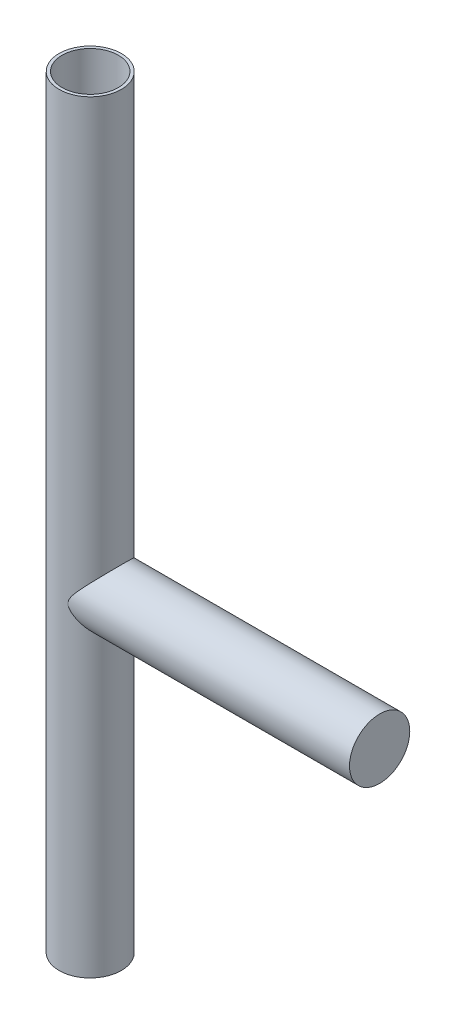
ISO-10303-21;
HEADER;
FILE_DESCRIPTION(('STEP AP214'),'2;1');
FILE_NAME('part.step','',(''),(''),'','','');
FILE_SCHEMA(('AUTOMOTIVE_DESIGN { 1 0 10303 214 1 1 1 1 }'));
ENDSEC;
DATA;
#1=APPLICATION_CONTEXT('core data for automotive mechanical design processes');
#2=APPLICATION_PROTOCOL_DEFINITION('international standard','automotive_design',2000,#1);
#3=PRODUCT_CONTEXT('',#1,'mechanical');
#4=PRODUCT('Part','Part','',(#3));
#5=PRODUCT_RELATED_PRODUCT_CATEGORY('part','',(#4));
#6=PRODUCT_DEFINITION_FORMATION('','',#4);
#7=PRODUCT_DEFINITION_CONTEXT('part definition',#1,'design');
#8=PRODUCT_DEFINITION('design','',#6,#7);
#9=PRODUCT_DEFINITION_SHAPE('','',#8);
#10=(LENGTH_UNIT() NAMED_UNIT(*) SI_UNIT(.MILLI.,.METRE.));
#11=(NAMED_UNIT(*) PLANE_ANGLE_UNIT() SI_UNIT($,.RADIAN.));
#12=(NAMED_UNIT(*) SI_UNIT($,.STERADIAN.) SOLID_ANGLE_UNIT());
#13=UNCERTAINTY_MEASURE_WITH_UNIT(LENGTH_MEASURE(1.E-05),#10,'distance_accuracy_value','');
#14=(GEOMETRIC_REPRESENTATION_CONTEXT(3) GLOBAL_UNCERTAINTY_ASSIGNED_CONTEXT((#13)) GLOBAL_UNIT_ASSIGNED_CONTEXT((#10,
#11,#12)) REPRESENTATION_CONTEXT('',''));
#15=CARTESIAN_POINT('',(0.,0.,0.));
#16=DIRECTION('',(0.,0.,1.));
#17=DIRECTION('',(1.,0.,0.));
#18=AXIS2_PLACEMENT_3D('',#15,#16,#17);
#19=CARTESIAN_POINT('',(0.,-5.,0.));
#20=DIRECTION('',(0.,1.,0.));
#21=DIRECTION('',(0.,0.,1.));
#22=AXIS2_PLACEMENT_3D('',#19,#20,#21);
#23=CYLINDRICAL_SURFACE('',#22,7.75);
#24=CARTESIAN_POINT('',(0.,-5.,0.));
#25=DIRECTION('',(0.,1.,0.));
#26=DIRECTION('',(0.,0.,1.));
#27=AXIS2_PLACEMENT_3D('',#24,#25,#26);
#28=CIRCLE('',#27,7.75);
#29=CARTESIAN_POINT('',(0.,-5.,7.75));
#30=VERTEX_POINT('',#29);
#31=EDGE_CURVE('E70',#30,#30,#28,.T.);
#32=ORIENTED_EDGE('',*,*,#31,.T.);
#33=EDGE_LOOP('',(#32));
#34=FACE_BOUND('',#33,.T.);
#35=CARTESIAN_POINT('',(1.95256241897666,75.,7.5));
#36=CARTESIAN_POINT('',(1.95254027287941,75.1301890502717,7.50000356990272));
#37=CARTESIAN_POINT('',(1.96590520223219,75.2603568940081,7.49656241617327));
#38=CARTESIAN_POINT('',(2.01569819316504,75.5162819695374,7.48331854549107));
#39=CARTESIAN_POINT('',(2.05225463976761,75.6420105092941,7.47348040811489));
#40=CARTESIAN_POINT('',(2.13363712639972,75.865327485485,7.45060684486488));
#41=CARTESIAN_POINT('',(2.17590108832877,75.9639934948249,7.43843077396391));
#42=CARTESIAN_POINT('',(2.2681474237054,76.1572248140775,7.4108262060249));
#43=CARTESIAN_POINT('',(2.31813693956844,76.2517862245286,7.39539469440364));
#44=CARTESIAN_POINT('',(2.47617651022723,76.5305882452537,7.34460192400622));
#45=CARTESIAN_POINT('',(2.59210402189804,76.709487952865,7.30479296654339));
#46=CARTESIAN_POINT('',(2.85729149296307,77.0913591856681,7.20571259971662));
#47=CARTESIAN_POINT('',(3.00864163713575,77.2922162919602,7.14415925232692));
#48=CARTESIAN_POINT('',(3.3171934453091,77.6843476964629,7.00624041361422));
#49=CARTESIAN_POINT('',(3.47440032136982,77.8756130856665,6.92986146123077));
#50=CARTESIAN_POINT('',(3.79048844505221,78.2504467138194,6.76215779582004));
#51=CARTESIAN_POINT('',(3.94937144041231,78.4340056608059,6.67081565643868));
#52=CARTESIAN_POINT('',(4.26590173295146,78.7937680865314,6.47297704973329));
#53=CARTESIAN_POINT('',(4.42354936760267,78.969973635296,6.36648488496098));
#54=CARTESIAN_POINT('',(4.77008079089776,79.3530728523875,6.11265712391416));
#55=CARTESIAN_POINT('',(4.95818344072453,79.5581613734927,5.96149384180011));
#56=CARTESIAN_POINT('',(5.32639528655411,79.9561730500059,5.63494701276092));
#57=CARTESIAN_POINT('',(5.5065008896944,80.1490907534428,5.45955272210076));
#58=CARTESIAN_POINT('',(5.8547129489229,80.5198913908207,5.08429956510327));
#59=CARTESIAN_POINT('',(6.02285659504625,80.6978212711934,4.88452228632779));
#60=CARTESIAN_POINT('',(6.34382195995667,81.0360927605903,4.45974127182885));
#61=CARTESIAN_POINT('',(6.49665810123219,81.1964509390558,4.23476171295629));
#62=CARTESIAN_POINT('',(6.80364239113859,81.5176370856967,3.72473278881411));
#63=CARTESIAN_POINT('',(6.95478060459687,81.6751757748202,3.43570192792498));
#64=CARTESIAN_POINT('',(7.15644612432528,81.8849534856609,2.97918511429341));
#65=CARTESIAN_POINT('',(7.21950433346244,81.9504680102473,2.82315125802899));
#66=CARTESIAN_POINT('',(7.33630454717285,82.071713423744,2.50398942637429));
#67=CARTESIAN_POINT('',(7.3900510089274,82.1274489936331,2.34086489205796));
#68=CARTESIAN_POINT('',(7.48772711238075,82.2286745024491,2.00674606041653));
#69=CARTESIAN_POINT('',(7.53155773015203,82.2740611249008,1.83569132156844));
#70=CARTESIAN_POINT('',(7.6078174013041,82.3529918718908,1.48836051755561));
#71=CARTESIAN_POINT('',(7.64024647712757,82.3865360197397,1.3120844626692));
#72=CARTESIAN_POINT('',(7.69292481367634,82.4410107036105,0.955923074061227));
#73=CARTESIAN_POINT('',(7.7131830076892,82.4619504911098,0.77604048795549));
#74=CARTESIAN_POINT('',(7.74104528569166,82.490747330483,0.414265296344475));
#75=CARTESIAN_POINT('',(7.74865113994895,82.4986062125879,0.232372975619271));
#76=CARTESIAN_POINT('',(7.75086572435814,82.500894551507,-0.107713351385544));
#77=CARTESIAN_POINT('',(7.7470465594858,82.4969484027336,-0.265890370151748));
#78=CARTESIAN_POINT('',(7.72979138508297,82.4791162593342,-0.581155813814566));
#79=CARTESIAN_POINT('',(7.71635553573556,82.4652304302714,-0.738244256799352));
#80=CARTESIAN_POINT('',(7.6801250963743,82.4277751714667,-1.05015842492861));
#81=CARTESIAN_POINT('',(7.65733066802929,82.4042059090055,-1.20498418911287));
#82=CARTESIAN_POINT('',(7.60280151254774,82.347798502893,-1.51133056285157));
#83=CARTESIAN_POINT('',(7.57106646918115,82.3149600313892,-1.66285105529409));
#84=CARTESIAN_POINT('',(7.4999180044693,82.2412954292593,-1.95867303867399));
#85=CARTESIAN_POINT('',(7.46067229268881,82.2006436923805,-2.10305848479811));
#86=CARTESIAN_POINT('',(7.37470118482368,82.1115296651748,-2.38711899506823));
#87=CARTESIAN_POINT('',(7.32797365392898,82.0630651455759,-2.52679270098651));
#88=CARTESIAN_POINT('',(7.17748500075082,81.9068501535315,-2.9378934273682));
#89=CARTESIAN_POINT('',(7.06337770699466,81.7882367916999,-3.20156266232297));
#90=CARTESIAN_POINT('',(6.84637738953641,81.5620960088776,-3.6376074580444));
#91=CARTESIAN_POINT('',(6.74863418835963,81.4600743884691,-3.81555231105567));
#92=CARTESIAN_POINT('',(6.5429539975206,81.2448977289165,-4.15838545438968));
#93=CARTESIAN_POINT('',(6.43501588370935,81.1317414619453,-4.32327230116854));
#94=CARTESIAN_POINT('',(6.21036735788039,80.8955490620631,-4.64022495347486));
#95=CARTESIAN_POINT('',(6.09363518929716,80.7724883705079,-4.79225684512036));
#96=CARTESIAN_POINT('',(5.85316182217974,80.5180368091598,-5.08316928074444));
#97=CARTESIAN_POINT('',(5.72942075057901,80.386646090221,-5.22205006277217));
#98=CARTESIAN_POINT('',(5.43005788870909,80.0672657820773,-5.53529654472826));
#99=CARTESIAN_POINT('',(5.25198337696498,79.8761204328712,-5.70411469850548));
#100=CARTESIAN_POINT('',(4.88838841507936,79.4821454384826,-6.01863497610819));
#101=CARTESIAN_POINT('',(4.70286412060642,79.2793097365728,-6.164324967878));
#102=CARTESIAN_POINT('',(4.32780783607666,78.8633578794395,-6.43317336208854));
#103=CARTESIAN_POINT('',(4.13828151045811,78.6502557705075,-6.55636150349144));
#104=CARTESIAN_POINT('',(3.75872251288581,78.2136113870479,-6.78107931429117));
#105=CARTESIAN_POINT('',(3.56869020835096,77.9900753859155,-6.88262179881014));
#106=CARTESIAN_POINT('',(3.23422142691717,77.5804176578913,-7.04477821649563));
#107=CARTESIAN_POINT('',(3.08883901014458,77.3967029966683,-7.1094921177642));
#108=CARTESIAN_POINT('',(2.87670542265433,77.1134788910826,-7.19673195269228));
#109=CARTESIAN_POINT('',(2.80694578179858,77.0177381712533,-7.22418636545723));
#110=CARTESIAN_POINT('',(2.67053132359378,76.8231934127341,-7.27571861977974));
#111=CARTESIAN_POINT('',(2.60387604686119,76.7243898309137,-7.29979696199499));
#112=CARTESIAN_POINT('',(2.44170603015909,76.4708645470277,-7.35603077462036));
#113=CARTESIAN_POINT('',(2.34914032570697,76.3137036848471,-7.38590393395599));
#114=CARTESIAN_POINT('',(2.18375261076396,75.987843446622,-7.43647380921712));
#115=CARTESIAN_POINT('',(2.11085988094345,75.8191882054588,-7.45720356858238));
#116=CARTESIAN_POINT('',(2.02171618008148,75.5343924563744,-7.4817448089777));
#117=CARTESIAN_POINT('',(1.99447925788354,75.4221309836867,-7.48898274066381));
#118=CARTESIAN_POINT('',(1.95903966691131,75.1945637818613,-7.49833482995199));
#119=CARTESIAN_POINT('',(1.95078343428337,75.0792675505072,-7.50046340699817));
#120=CARTESIAN_POINT('',(1.95500219863361,74.8488888492252,-7.49936454467398));
#121=CARTESIAN_POINT('',(1.96751716142526,74.7338072189072,-7.49612677995322));
#122=CARTESIAN_POINT('',(2.01067644785891,74.5072296445273,-7.48466009422864));
#123=CARTESIAN_POINT('',(2.04137116110638,74.3957445783591,-7.47641729895754));
#124=CARTESIAN_POINT('',(2.11124425163456,74.192030006266,-7.45696184233885));
#125=CARTESIAN_POINT('',(2.14881562505552,74.0991728124093,-7.44627002769129));
#126=CARTESIAN_POINT('',(2.23126745170366,73.9171115507853,-7.42198045069847));
#127=CARTESIAN_POINT('',(2.27615471921823,73.8279109868178,-7.40837997539909));
#128=CARTESIAN_POINT('',(2.37129101172992,73.6524160318184,-7.37848068654962));
#129=CARTESIAN_POINT('',(2.42156263489764,73.5661360623893,-7.36217032827195));
#130=CARTESIAN_POINT('',(2.5257751687595,73.3964058989416,-7.32707228926546));
#131=CARTESIAN_POINT('',(2.57971490246393,73.3129548099765,-7.30828540138392));
#132=CARTESIAN_POINT('',(2.71840224747815,73.1063971949827,-7.25814312053561));
#133=CARTESIAN_POINT('',(2.80482384387862,72.9847876231463,-7.22526652273103));
#134=CARTESIAN_POINT('',(2.98123783204384,72.7457264959351,-7.15428459342945));
#135=CARTESIAN_POINT('',(3.07123161782724,72.6282765983539,-7.1161772061114));
#136=CARTESIAN_POINT('',(3.25340740517797,72.3966798065256,-7.03475708264581));
#137=CARTESIAN_POINT('',(3.34559201782877,72.2825372546658,-6.99143785657831));
#138=CARTESIAN_POINT('',(3.53104345280444,72.0572405424322,-6.89963426250104));
#139=CARTESIAN_POINT('',(3.62431040768229,71.9460867537373,-6.85114925576766));
#140=CARTESIAN_POINT('',(3.90469664444104,71.6165678565567,-6.69784878168772));
#141=CARTESIAN_POINT('',(4.0923402536245,71.4022210232242,-6.58521463103373));
#142=CARTESIAN_POINT('',(4.46468347287635,70.9838013499097,-6.33869131205799));
#143=CARTESIAN_POINT('',(4.64938534354837,70.7797203320953,-6.20481942670768));
#144=CARTESIAN_POINT('',(4.98367927569591,70.4142527778987,-5.93830512381304));
#145=CARTESIAN_POINT('',(5.13413680618987,70.2512819918157,-5.80893408684942));
#146=CARTESIAN_POINT('',(5.42917193428811,69.9337553727086,-5.53419195861925));
#147=CARTESIAN_POINT('',(5.57374849376934,69.7792010237571,-5.38881805913076));
#148=CARTESIAN_POINT('',(5.99534743655019,69.3305888588968,-4.92858519858198));
#149=CARTESIAN_POINT('',(6.2612522124272,69.0504853290095,-4.58883251688156));
#150=CARTESIAN_POINT('',(6.68056512454135,68.6109114307562,-3.94191283325759));
#151=CARTESIAN_POINT('',(6.8450451348759,68.4392087911171,-3.65030961219098));
#152=CARTESIAN_POINT('',(7.06626080229294,68.2088291137177,-3.18743418734476));
#153=CARTESIAN_POINT('',(7.13574572732094,68.1365679404697,-3.02890605250445));
#154=CARTESIAN_POINT('',(7.26514755941465,68.0021288215223,-2.7038308639568));
#155=CARTESIAN_POINT('',(7.32506582139295,67.9399494479329,-2.53728495015218));
#156=CARTESIAN_POINT('',(7.42607041884569,67.8352122238539,-2.22240882282034));
#157=CARTESIAN_POINT('',(7.46863250494605,67.7911111671621,-2.0750632112109));
#158=CARTESIAN_POINT('',(7.54536227034881,67.7116463670265,-1.77590561385838));
#159=CARTESIAN_POINT('',(7.57953144814348,67.6762810638716,-1.62409443083812));
#160=CARTESIAN_POINT('',(7.63889095729658,67.6148651229367,-1.31692911782155));
#161=CARTESIAN_POINT('',(7.66408486499287,67.5888107750468,-1.16157642530945));
#162=CARTESIAN_POINT('',(7.70505181339951,67.5464536995863,-0.848308586543059));
#163=CARTESIAN_POINT('',(7.72082474811813,67.5301510817287,-0.6903934114798));
#164=CARTESIAN_POINT('',(7.74267536431238,67.5075684862173,-0.372698536172449));
#165=CARTESIAN_POINT('',(7.74872388511626,67.5013186538993,-0.212914669877019));
#166=CARTESIAN_POINT('',(7.75091283288039,67.4990567378023,0.106793936134085));
#167=CARTESIAN_POINT('',(7.7470532490232,67.5030446652005,0.266718676003372));
#168=CARTESIAN_POINT('',(7.72950286697246,67.5211819253413,0.585461348422942));
#169=CARTESIAN_POINT('',(7.71581102520552,67.5353323367069,0.744279161679741));
#170=CARTESIAN_POINT('',(7.67886574858892,67.5735269088175,1.05958530949372));
#171=CARTESIAN_POINT('',(7.65561238406324,67.5975709967957,1.21607366117507));
#172=CARTESIAN_POINT('',(7.60120639027559,67.6538521494461,1.51879920424658));
#173=CARTESIAN_POINT('',(7.57044825176574,67.6856801996299,1.66518380575865));
#174=CARTESIAN_POINT('',(7.50108421931344,67.7574969661752,1.95405768952563));
#175=CARTESIAN_POINT('',(7.46247536655688,67.7974887593488,2.09654548009397));
#176=CARTESIAN_POINT('',(7.33568823909152,67.9289067374357,2.517084366705));
#177=CARTESIAN_POINT('',(7.2365140742332,68.031811992587,2.78840196165883));
#178=CARTESIAN_POINT('',(7.04767030891197,68.2281728172955,3.2298441746521));
#179=CARTESIAN_POINT('',(6.96422111951203,68.3150490189622,3.40572684810952));
#180=CARTESIAN_POINT('',(6.7871010108309,68.4997752018249,3.74627564451735));
#181=CARTESIAN_POINT('',(6.69342684066661,68.5976286733591,3.91093817300184));
#182=CARTESIAN_POINT('',(6.39895314391098,68.9059159182756,4.38813382240221));
#183=CARTESIAN_POINT('',(6.18492207997442,69.1308489170234,4.68337854030551));
#184=CARTESIAN_POINT('',(5.80429472867883,69.5337220845628,5.14113393117714));
#185=CARTESIAN_POINT('',(5.64409298887496,69.7040384546007,5.31609945829633));
#186=CARTESIAN_POINT('',(5.31495938398476,70.0562921696452,5.64515827224314));
#187=CARTESIAN_POINT('',(5.14602359860733,70.2382347418915,5.79924207191395));
#188=CARTESIAN_POINT('',(4.80226359823655,70.611988315471,6.0869508369384));
#189=CARTESIAN_POINT('',(4.62744405222879,70.8037915529146,6.22059157844494));
#190=CARTESIAN_POINT('',(4.27447335653798,71.1965751083213,6.46821713069223));
#191=CARTESIAN_POINT('',(4.09632352718351,71.3975518330758,6.58220955541836));
#192=CARTESIAN_POINT('',(3.73491438100616,71.8143477918852,6.79395342805739));
#193=CARTESIAN_POINT('',(3.55164483015955,72.0304192761152,6.89119412185364));
#194=CARTESIAN_POINT('',(3.2802809454079,72.3633760397362,7.02227970135439));
#195=CARTESIAN_POINT('',(3.19036253278028,72.4759080204377,7.06353299924593));
#196=CARTESIAN_POINT('',(3.0127964347602,72.7044258960287,7.14107255141409));
#197=CARTESIAN_POINT('',(2.92514844291636,72.8204113201971,7.17735947889158));
#198=CARTESIAN_POINT('',(2.77048898723196,73.0334402954281,7.23825835964615));
#199=CARTESIAN_POINT('',(2.70280222510427,73.1297361663225,7.26376416720267));
#200=CARTESIAN_POINT('',(2.5711370244475,73.3256291305036,7.31140529448361));
#201=CARTESIAN_POINT('',(2.50715764099913,73.4252253723442,7.33354147540362));
#202=CARTESIAN_POINT('',(2.3847968889834,73.6283837653794,7.3742381293891));
#203=CARTESIAN_POINT('',(2.32640834468138,73.7319405875643,7.39280321763623));
#204=CARTESIAN_POINT('',(2.21801632314516,73.943883092654,7.42604304105235));
#205=CARTESIAN_POINT('',(2.16800416460252,74.0522636268904,7.44072181329136));
#206=CARTESIAN_POINT('',(2.07177383643325,74.296639772884,7.46814667247941));
#207=CARTESIAN_POINT('',(2.02824367384823,74.4338696270216,7.47994246052326));
#208=CARTESIAN_POINT('',(1.96874742834689,74.7141070116345,7.49583999418336));
#209=CARTESIAN_POINT('',(1.9525867330331,74.8570662866797,7.49999608062697));
#210=CARTESIAN_POINT('',(1.95256241897666,75.,7.5));
#211=B_SPLINE_CURVE_WITH_KNOTS('',3,(#35,#36,#37,#38,#39,#40,#41,#42,#43,#44,#45,#46,#47,#48,
#49,#50,#51,#52,#53,#54,#55,#56,#57,#58,#59,#60,#61,#62,#63,#64,#65,#66,#67,#68,#69,#70,#71,#72,
#73,#74,#75,#76,#77,#78,#79,#80,#81,#82,#83,#84,#85,#86,#87,#88,#89,#90,#91,#92,#93,#94,#95,#96,
#97,#98,#99,#100,#101,#102,#103,#104,#105,#106,#107,#108,#109,#110,#111,#112,#113,#114,#115,
#116,#117,#118,#119,#120,#121,#122,#123,#124,#125,#126,#127,#128,#129,#130,#131,#132,#133,#134,
#135,#136,#137,#138,#139,#140,#141,#142,#143,#144,#145,#146,#147,#148,#149,#150,#151,#152,#153,
#154,#155,#156,#157,#158,#159,#160,#161,#162,#163,#164,#165,#166,#167,#168,#169,#170,#171,#172,
#173,#174,#175,#176,#177,#178,#179,#180,#181,#182,#183,#184,#185,#186,#187,#188,#189,#190,#191,
#192,#193,#194,#195,#196,#197,#198,#199,#200,#201,#202,#203,#204,#205,#206,#207,#208,#209,#210),
.UNSPECIFIED.,.T.,.F.,(4,2,2,2,2,2,2,2,2,2,2,2,2,2,2,2,2,2,2,2,2,2,2,2,2,2,2,2,2,2,2,2,2,2,2,2,
2,2,2,2,2,2,2,2,2,2,2,2,2,2,2,2,2,2,2,2,2,2,2,2,2,2,2,2,2,2,2,2,2,2,2,2,2,2,2,2,2,2,2,2,2,2,2,2,
2,2,2,4),(0.,0.389965564005651,0.782108988864908,1.1057137636422,1.42961952673076,
2.07891859918032,2.8549128169626,3.63161493055298,4.4092281193448,5.18662090806519,
6.13550681260253,7.08481480004491,8.03102919172628,8.97634351877103,10.0584379073188,
10.5996994453947,11.1407011819244,11.6868880161218,12.2330737752045,12.7788581488699,
13.3245661520178,13.7987861199812,14.2729981891474,14.7472020666762,15.2214227189288,
15.6860822606644,16.1508746221569,17.0799467438483,17.7607803274752,18.4416890715191,
19.124341510672,19.8069815907228,20.7387557636887,21.6710171023497,22.6020372847638,
23.5325047244496,24.2610626590175,24.6257618322243,24.9904068646771,25.5440561389555,
26.095687843728,26.441544400224,26.786423738741,27.131967428461,27.4784733885602,
27.7802416308171,28.0822925743102,28.3856649695257,28.6889404765525,29.1469904800454,
29.6052210259879,30.0640281962207,30.5228921617043,31.4409221238513,32.3582088025692,
33.1278291547124,33.8975847776859,35.4320894342603,36.556432885814,37.1185470293559,
37.6805814907327,38.1588503617203,38.6370337791346,39.1150264431436,39.5930244847623,
40.0724532469814,40.5518825326298,41.0313627113298,41.5108393635676,41.9691272636757,
42.427588206689,43.3439233557735,43.982695665884,44.621671659125,45.9013675912406,
46.7765099119065,47.6520485108973,48.526908000108,49.4014277036395,50.2991346216391,
50.7485376087935,51.1978796180658,51.5590728734699,51.9201736610047,52.280804589343,
52.6410594144758,53.0722793711016,53.5004200328087),.UNSPECIFIED.);
#212=CARTESIAN_POINT('',(1.95256241897666,75.,7.5));
#213=VERTEX_POINT('',#212);
#214=EDGE_CURVE('E76',#213,#213,#211,.T.);
#215=ORIENTED_EDGE('',*,*,#214,.T.);
#216=EDGE_LOOP('',(#215));
#217=FACE_BOUND('',#216,.T.);
#218=CARTESIAN_POINT('',(0.,185.,0.));
#219=DIRECTION('',(0.,1.,0.));
#220=DIRECTION('',(0.,0.,1.));
#221=AXIS2_PLACEMENT_3D('',#218,#219,#220);
#222=CIRCLE('',#221,7.75);
#223=CARTESIAN_POINT('',(0.,185.,7.75));
#224=VERTEX_POINT('',#223);
#225=EDGE_CURVE('E78',#224,#224,#222,.T.);
#226=ORIENTED_EDGE('',*,*,#225,.F.);
#227=EDGE_LOOP('',(#226));
#228=FACE_BOUND('',#227,.T.);
#229=ADVANCED_FACE('F35',(#34,#217,#228),#23,.T.);
#230=CARTESIAN_POINT('',(0.,-5.,0.));
#231=DIRECTION('',(0.,1.,0.));
#232=DIRECTION('',(0.,0.,1.));
#233=AXIS2_PLACEMENT_3D('',#230,#231,#232);
#234=CYLINDRICAL_SURFACE('',#233,7.);
#235=CARTESIAN_POINT('',(0.,-5.,0.));
#236=DIRECTION('',(0.,1.,0.));
#237=DIRECTION('',(0.,0.,1.));
#238=AXIS2_PLACEMENT_3D('',#235,#236,#237);
#239=CIRCLE('',#238,7.);
#240=CARTESIAN_POINT('',(0.,-5.,7.));
#241=VERTEX_POINT('',#240);
#242=EDGE_CURVE('E86',#241,#241,#239,.T.);
#243=ORIENTED_EDGE('',*,*,#242,.F.);
#244=EDGE_LOOP('',(#243));
#245=FACE_BOUND('',#244,.T.);
#246=DIRECTION('',(0.,1.,0.));
#247=VECTOR('',#246,1.);
#248=CARTESIAN_POINT('',(0.,-5.,-7.));
#249=LINE('',#248,#247);
#250=CARTESIAN_POINT('',(0.,77.6925824035672,-7.));
#251=VERTEX_POINT('',#250);
#252=CARTESIAN_POINT('',(0.,72.3074175964327,-7.));
#253=VERTEX_POINT('',#252);
#254=EDGE_CURVE('E11',#251,#253,#249,.F.);
#255=ORIENTED_EDGE('',*,*,#254,.F.);
#256=CARTESIAN_POINT('',(0.,77.6925824035672,7.));
#257=CARTESIAN_POINT('',(0.0946610655207335,77.6924617618599,7.00002488804256));
#258=CARTESIAN_POINT('',(0.189229245799089,77.6975722107889,6.99808107045153));
#259=CARTESIAN_POINT('',(0.376896117070595,77.7172681915499,6.99046792032722));
#260=CARTESIAN_POINT('',(0.469998842608382,77.7318199072187,6.98481188316449));
#261=CARTESIAN_POINT('',(0.652226065310895,77.7690334735146,6.970137541565));
#262=CARTESIAN_POINT('',(0.741393027120209,77.7915205440642,6.96119153412454));
#263=CARTESIAN_POINT('',(0.917398797945524,77.8433344081263,6.9401900404014));
#264=CARTESIAN_POINT('',(1.00423524015631,77.8726678818289,6.92813151594063));
#265=CARTESIAN_POINT('',(1.22305733204779,77.9547545010805,6.89364508106415));
#266=CARTESIAN_POINT('',(1.35323719299942,78.0114493930539,6.8691833390435));
#267=CARTESIAN_POINT('',(1.60776513569023,78.1340802650909,6.81410812289273));
#268=CARTESIAN_POINT('',(1.73210959320663,78.2000218892873,6.78349088650901));
#269=CARTESIAN_POINT('',(1.97716723811045,78.3389943330469,6.7161856919196));
#270=CARTESIAN_POINT('',(2.09781668874408,78.4121025856656,6.67942748941002));
#271=CARTESIAN_POINT('',(2.33458895173086,78.5625816231125,6.60039857282037));
#272=CARTESIAN_POINT('',(2.45070998237745,78.6399540573581,6.55812571686467));
#273=CARTESIAN_POINT('',(2.78546224607228,78.870793718325,6.42631489075814));
#274=CARTESIAN_POINT('',(2.99870901603323,79.0279387828526,6.32946123158019));
#275=CARTESIAN_POINT('',(3.41293859652644,79.345186408228,6.11605100301964));
#276=CARTESIAN_POINT('',(3.6139120104307,79.5052911158196,5.99947958862569));
#277=CARTESIAN_POINT('',(4.00339852240037,79.8233432614598,5.74686372650116));
#278=CARTESIAN_POINT('',(4.19195835190984,79.9812967754382,5.61089923494131));
#279=CARTESIAN_POINT('',(4.5569838987627,80.2921637152147,5.31869405733161));
#280=CARTESIAN_POINT('',(4.73345653466681,80.4450799977976,5.16246512113418));
#281=CARTESIAN_POINT('',(5.02854439546942,80.7037398761401,4.87283526537856));
#282=CARTESIAN_POINT('',(5.15019859361971,80.8113403319919,4.74418761034029));
#283=CARTESIAN_POINT('',(5.38544532978824,81.0208104819128,4.47536808034486));
#284=CARTESIAN_POINT('',(5.49903626164003,81.122679033379,4.33519392129555));
#285=CARTESIAN_POINT('',(5.82596504512083,81.417392009994,3.89749826032098));
#286=CARTESIAN_POINT('',(6.02596902217855,81.5997951323005,3.58231167963362));
#287=CARTESIAN_POINT('',(6.34254619187062,81.8901985647684,2.97711771511023));
#288=CARTESIAN_POINT('',(6.46781927296167,82.0057849172501,2.69535765849592));
#289=CARTESIAN_POINT('',(6.62876931061292,82.1547309170988,2.25475979454341));
#290=CARTESIAN_POINT('',(6.6779346951737,82.2003154040709,2.10486241204842));
#291=CARTESIAN_POINT('',(6.76651285851101,82.2825423948951,1.79985652869024));
#292=CARTESIAN_POINT('',(6.80592995826684,82.319188860473,1.64475037139703));
#293=CARTESIAN_POINT('',(6.87457231695769,82.383060712161,1.32911227039937));
#294=CARTESIAN_POINT('',(6.90371850743404,82.4102129974406,1.16854823972112));
#295=CARTESIAN_POINT('',(6.95081739334839,82.4541122488016,0.844368791341859));
#296=CARTESIAN_POINT('',(6.96877005390224,82.4708591824553,0.680753364132943));
#297=CARTESIAN_POINT('',(6.99308710673336,82.4935470997325,0.351983120351204));
#298=CARTESIAN_POINT('',(6.99945629962469,82.499492559882,0.186828970018372));
#299=CARTESIAN_POINT('',(7.00047676869168,82.5004449705671,-0.143538279798145));
#300=CARTESIAN_POINT('',(6.99512914411734,82.4954529472371,-0.308751372298031));
#301=CARTESIAN_POINT('',(6.97412781370777,82.475857601881,-0.618727879686724));
#302=CARTESIAN_POINT('',(6.9597326151339,82.4624280102415,-0.763654123116244));
#303=CARTESIAN_POINT('',(6.92211151462391,82.4273536014174,-1.05139506613721));
#304=CARTESIAN_POINT('',(6.89888273743804,82.4057061093848,-1.19420906247076));
#305=CARTESIAN_POINT('',(6.8439740551999,82.3545822625986,-1.47672470394708));
#306=CARTESIAN_POINT('',(6.81229682849935,82.3251083889999,-1.61642732028665));
#307=CARTESIAN_POINT('',(6.74096112651629,82.2588143067817,-1.89201946259874));
#308=CARTESIAN_POINT('',(6.70129961730356,82.2219913056291,-2.02790751665077));
#309=CARTESIAN_POINT('',(6.56819271247392,82.0985921767265,-2.43783896674608));
#310=CARTESIAN_POINT('',(6.46249375338286,82.0008330325033,-2.70468721833343));
#311=CARTESIAN_POINT('',(6.22421888513482,81.7814990473266,-3.21539070887082));
#312=CARTESIAN_POINT('',(6.09162909536007,81.6599119078392,-3.45923397738368));
#313=CARTESIAN_POINT('',(5.83851033423516,81.4293212227008,-3.86715553976302));
#314=CARTESIAN_POINT('',(5.72263105781815,81.3242186169792,-4.03639869794065));
#315=CARTESIAN_POINT('',(5.47965706149596,81.1052326623977,-4.36054961043065));
#316=CARTESIAN_POINT('',(5.35256102738297,80.9913482848222,-4.51545568057505));
#317=CARTESIAN_POINT('',(5.08825414564575,80.7564439090436,-4.81135399877937));
#318=CARTESIAN_POINT('',(4.9510198586019,80.6354075134653,-4.95231212183667));
#319=CARTESIAN_POINT('',(4.6677715084258,80.3882555513811,-5.22014346360557));
#320=CARTESIAN_POINT('',(4.52175881654622,80.2621407791667,-5.34701887337521));
#321=CARTESIAN_POINT('',(4.21788401134645,80.0034011997944,-5.59001301471204));
#322=CARTESIAN_POINT('',(4.05981759948949,79.870692496633,-5.70578607011991));
#323=CARTESIAN_POINT('',(3.73540330024264,79.6037715442358,-5.92325220194012));
#324=CARTESIAN_POINT('',(3.5690531209101,79.4695588869374,-6.02494135187636));
#325=CARTESIAN_POINT('',(3.22809765126719,79.202307043034,-6.21428825611248));
#326=CARTESIAN_POINT('',(3.05350431672162,79.06926647,-6.3019655694109));
#327=CARTESIAN_POINT('',(2.69496161380759,78.8075895422221,-6.46342276914738));
#328=CARTESIAN_POINT('',(2.51101825183765,78.6789504466927,-6.53721143778083));
#329=CARTESIAN_POINT('',(2.13969282274376,78.4364613312586,-6.66774794973314));
#330=CARTESIAN_POINT('',(1.95277763695367,78.3222175175049,-6.72508018278046));
#331=CARTESIAN_POINT('',(1.56579262077768,78.1105374716385,-6.82555314090248));
#332=CARTESIAN_POINT('',(1.36573783691141,78.0130824622001,-6.86870977023647));
#333=CARTESIAN_POINT('',(1.00554306363907,77.8708204625622,-6.92912312612924));
#334=CARTESIAN_POINT('',(0.848943424873078,77.8189045945821,-6.95021575165404));
#335=CARTESIAN_POINT('',(0.528783407355056,77.7397038615444,-6.98182900695977));
#336=CARTESIAN_POINT('',(0.365256527084353,77.712312090767,-6.9923955451241));
#337=CARTESIAN_POINT('',(0.167299653536161,77.6975634827721,-6.99808161336338));
#338=CARTESIAN_POINT('',(0.133883994341021,77.6956991535029,-6.99880012136431));
#339=CARTESIAN_POINT('',(0.0669820922605683,77.6932104949604,-6.99975883324395));
#340=CARTESIAN_POINT('',(0.0334958215445422,77.6925868166576,-6.9999987860245));
#341=CARTESIAN_POINT('',(0.,77.6925824035672,-7.));
#342=B_SPLINE_CURVE_WITH_KNOTS('',3,(#256,#257,#258,#259,#260,#261,#262,#263,#264,#265,#266,
#267,#268,#269,#270,#271,#272,#273,#274,#275,#276,#277,#278,#279,#280,#281,#282,#283,#284,#285,
#286,#287,#288,#289,#290,#291,#292,#293,#294,#295,#296,#297,#298,#299,#300,#301,#302,#303,#304,
#305,#306,#307,#308,#309,#310,#311,#312,#313,#314,#315,#316,#317,#318,#319,#320,#321,#322,#323,
#324,#325,#326,#327,#328,#329,#330,#331,#332,#333,#334,#335,#336,#337,#338,#339,#340,#341),
.UNSPECIFIED.,.F.,.F.,(4,2,2,2,2,2,2,2,2,2,2,2,2,2,2,2,2,2,2,2,2,2,2,2,2,2,2,2,2,2,2,2,2,2,2,2,
2,2,2,2,2,2,4),(0.,0.283677337906275,0.566344185008949,0.843138255549629,1.12020353778011,
1.55166385560209,1.98338868917262,2.42044050802827,2.85766258478568,3.70259984050624,
4.54817608337328,5.39036177984067,6.23206131994082,6.85309270304191,7.47424744766916,
8.71406144278616,9.69777632275279,10.189872084703,10.6817493300529,11.1773344658334,
11.672921146076,12.1683023901681,12.6636371605045,13.1018974239796,13.540300459462,
13.9785646760221,14.4169957430713,15.3229433595901,16.2293598074851,16.9198760522717,
17.6104733088531,18.3027204391807,18.9948597148658,19.7041996366982,20.4137369202495,
21.1222749487616,21.830363431682,22.5087880109179,23.1864488137827,23.6838252583158,
24.1790228257303,24.2794320114044,24.3798938679828),.UNSPECIFIED.);
#343=CARTESIAN_POINT('',(0.,77.6925824035672,7.));
#344=VERTEX_POINT('',#343);
#345=EDGE_CURVE('E43',#344,#251,#342,.T.);
#346=ORIENTED_EDGE('',*,*,#345,.F.);
#347=DIRECTION('',(0.,1.,0.));
#348=VECTOR('',#347,1.);
#349=CARTESIAN_POINT('',(0.,-5.,7.));
#350=LINE('',#349,#348);
#351=CARTESIAN_POINT('',(0.,72.3074175964327,7.));
#352=VERTEX_POINT('',#351);
#353=EDGE_CURVE('E60',#352,#344,#350,.T.);
#354=ORIENTED_EDGE('',*,*,#353,.F.);
#355=CARTESIAN_POINT('',(0.,72.3074175964327,-7.));
#356=CARTESIAN_POINT('',(0.0946610655207333,72.3075382381401,-7.00002488804256));
#357=CARTESIAN_POINT('',(0.189229245799089,72.3024277892111,-6.99808107045153));
#358=CARTESIAN_POINT('',(0.376896117070595,72.2827318084501,-6.99046792032722));
#359=CARTESIAN_POINT('',(0.469998842608382,72.2681800927813,-6.98481188316449));
#360=CARTESIAN_POINT('',(0.652226065310894,72.2309665264854,-6.970137541565));
#361=CARTESIAN_POINT('',(0.741393027120206,72.2084794559358,-6.96119153412454));
#362=CARTESIAN_POINT('',(0.917398797945522,72.1566655918737,-6.94019004040141));
#363=CARTESIAN_POINT('',(1.00423524015631,72.127332118171,-6.92813151594063));
#364=CARTESIAN_POINT('',(1.22305733204779,72.0452454989195,-6.89364508106415));
#365=CARTESIAN_POINT('',(1.35323719299943,71.9885506069461,-6.8691833390435));
#366=CARTESIAN_POINT('',(1.60776513569024,71.8659197349091,-6.81410812289273));
#367=CARTESIAN_POINT('',(1.73210959320664,71.7999781107127,-6.78349088650901));
#368=CARTESIAN_POINT('',(1.97716723811045,71.6610056669531,-6.7161856919196));
#369=CARTESIAN_POINT('',(2.09781668874409,71.5878974143344,-6.67942748941002));
#370=CARTESIAN_POINT('',(2.33458895173087,71.4374183768875,-6.60039857282037));
#371=CARTESIAN_POINT('',(2.45070998237745,71.3600459426419,-6.55812571686467));
#372=CARTESIAN_POINT('',(2.78546224607228,71.129206281675,-6.42631489075813));
#373=CARTESIAN_POINT('',(2.99870901603323,70.9720612171473,-6.32946123158019));
#374=CARTESIAN_POINT('',(3.41293859652645,70.654813591772,-6.11605100301964));
#375=CARTESIAN_POINT('',(3.61391201043071,70.4947088841803,-5.99947958862569));
#376=CARTESIAN_POINT('',(4.00339852240038,70.1766567385401,-5.74686372650115));
#377=CARTESIAN_POINT('',(4.19195835190985,70.0187032245618,-5.6108992349413));
#378=CARTESIAN_POINT('',(4.55698389876271,69.7078362847853,-5.31869405733161));
#379=CARTESIAN_POINT('',(4.73345653466681,69.5549200022023,-5.16246512113418));
#380=CARTESIAN_POINT('',(5.02854439546942,69.2962601238599,-4.87283526537856));
#381=CARTESIAN_POINT('',(5.15019859361971,69.1886596680081,-4.74418761034029));
#382=CARTESIAN_POINT('',(5.38544532978824,68.9791895180872,-4.47536808034486));
#383=CARTESIAN_POINT('',(5.49903626164003,68.877320966621,-4.33519392129555));
#384=CARTESIAN_POINT('',(5.82596504512083,68.5826079900059,-3.89749826032098));
#385=CARTESIAN_POINT('',(6.02596902217855,68.4002048676995,-3.58231167963362));
#386=CARTESIAN_POINT('',(6.34254619187062,68.1098014352316,-2.97711771511023));
#387=CARTESIAN_POINT('',(6.46781927296167,67.9942150827499,-2.69535765849592));
#388=CARTESIAN_POINT('',(6.62876931061292,67.8452690829012,-2.25475979454341));
#389=CARTESIAN_POINT('',(6.6779346951737,67.7996845959291,-2.10486241204842));
#390=CARTESIAN_POINT('',(6.76651285851101,67.7174576051049,-1.79985652869024));
#391=CARTESIAN_POINT('',(6.80592995826684,67.680811139527,-1.64475037139703));
#392=CARTESIAN_POINT('',(6.87457231695769,67.616939287839,-1.32911227039937));
#393=CARTESIAN_POINT('',(6.90371850743404,67.5897870025594,-1.16854823972112));
#394=CARTESIAN_POINT('',(6.95081739334839,67.5458877511983,-0.844368791341859));
#395=CARTESIAN_POINT('',(6.96877005390224,67.5291408175447,-0.680753364132943));
#396=CARTESIAN_POINT('',(6.99308710673336,67.5064529002675,-0.351983120351204));
#397=CARTESIAN_POINT('',(6.99945629962469,67.500507440118,-0.186828970018372));
#398=CARTESIAN_POINT('',(7.00047676869168,67.4995550294329,0.143538279798145));
#399=CARTESIAN_POINT('',(6.99512914411734,67.5045470527628,0.308751372298031));
#400=CARTESIAN_POINT('',(6.97412781370777,67.524142398119,0.618727879686724));
#401=CARTESIAN_POINT('',(6.9597326151339,67.5375719897585,0.763654123116244));
#402=CARTESIAN_POINT('',(6.92211151462391,67.5726463985825,1.05139506613721));
#403=CARTESIAN_POINT('',(6.89888273743804,67.5942938906151,1.19420906247076));
#404=CARTESIAN_POINT('',(6.8439740551999,67.6454177374014,1.47672470394708));
#405=CARTESIAN_POINT('',(6.81229682849935,67.6748916110001,1.61642732028665));
#406=CARTESIAN_POINT('',(6.74096112651629,67.7411856932183,1.89201946259874));
#407=CARTESIAN_POINT('',(6.70129961730356,67.7780086943709,2.02790751665077));
#408=CARTESIAN_POINT('',(6.56819271247392,67.9014078232735,2.43783896674608));
#409=CARTESIAN_POINT('',(6.46249375338286,67.9991669674966,2.70468721833343));
#410=CARTESIAN_POINT('',(6.22421888513482,68.2185009526734,3.21539070887082));
#411=CARTESIAN_POINT('',(6.09162909536007,68.3400880921608,3.45923397738368));
#412=CARTESIAN_POINT('',(5.83851033423516,68.5706787772991,3.86715553976302));
#413=CARTESIAN_POINT('',(5.72263105781815,68.6757813830208,4.03639869794065));
#414=CARTESIAN_POINT('',(5.47965706149596,68.8947673376023,4.36054961043065));
#415=CARTESIAN_POINT('',(5.35256102738297,69.0086517151777,4.51545568057505));
#416=CARTESIAN_POINT('',(5.08825414564575,69.2435560909564,4.81135399877937));
#417=CARTESIAN_POINT('',(4.9510198586019,69.3645924865347,4.95231212183667));
#418=CARTESIAN_POINT('',(4.6677715084258,69.6117444486189,5.22014346360557));
#419=CARTESIAN_POINT('',(4.52175881654622,69.7378592208333,5.34701887337521));
#420=CARTESIAN_POINT('',(4.21788401134645,69.9965988002056,5.59001301471204));
#421=CARTESIAN_POINT('',(4.05981759948949,70.129307503367,5.70578607011991));
#422=CARTESIAN_POINT('',(3.73540330024264,70.3962284557642,5.92325220194012));
#423=CARTESIAN_POINT('',(3.5690531209101,70.5304411130626,6.02494135187636));
#424=CARTESIAN_POINT('',(3.22809765126719,70.797692956966,6.21428825611248));
#425=CARTESIAN_POINT('',(3.05350431672162,70.93073353,6.3019655694109));
#426=CARTESIAN_POINT('',(2.69496161380759,71.1924104577779,6.46342276914738));
#427=CARTESIAN_POINT('',(2.51101825183765,71.3210495533073,6.53721143778083));
#428=CARTESIAN_POINT('',(2.13969282274376,71.5635386687414,6.66774794973314));
#429=CARTESIAN_POINT('',(1.95277763695367,71.6777824824951,6.72508018278046));
#430=CARTESIAN_POINT('',(1.56579262077768,71.8894625283615,6.82555314090248));
#431=CARTESIAN_POINT('',(1.36573783691141,71.9869175377999,6.86870977023647));
#432=CARTESIAN_POINT('',(1.00554306363907,72.1291795374378,6.92912312612924));
#433=CARTESIAN_POINT('',(0.848943424873078,72.1810954054178,6.95021575165404));
#434=CARTESIAN_POINT('',(0.528783407355056,72.2602961384556,6.98182900695977));
#435=CARTESIAN_POINT('',(0.365256527084353,72.287687909233,6.9923955451241));
#436=CARTESIAN_POINT('',(0.167299653536161,72.3024365172279,6.99808161336338));
#437=CARTESIAN_POINT('',(0.133883994341021,72.3043008464971,6.99880012136431));
#438=CARTESIAN_POINT('',(0.0669820922605683,72.3067895050396,6.99975883324395));
#439=CARTESIAN_POINT('',(0.0334958215445422,72.3074131833424,6.9999987860245));
#440=CARTESIAN_POINT('',(0.,72.3074175964327,7.));
#441=B_SPLINE_CURVE_WITH_KNOTS('',3,(#355,#356,#357,#358,#359,#360,#361,#362,#363,#364,#365,
#366,#367,#368,#369,#370,#371,#372,#373,#374,#375,#376,#377,#378,#379,#380,#381,#382,#383,#384,
#385,#386,#387,#388,#389,#390,#391,#392,#393,#394,#395,#396,#397,#398,#399,#400,#401,#402,#403,
#404,#405,#406,#407,#408,#409,#410,#411,#412,#413,#414,#415,#416,#417,#418,#419,#420,#421,#422,
#423,#424,#425,#426,#427,#428,#429,#430,#431,#432,#433,#434,#435,#436,#437,#438,#439,#440),
.UNSPECIFIED.,.F.,.F.,(4,2,2,2,2,2,2,2,2,2,2,2,2,2,2,2,2,2,2,2,2,2,2,2,2,2,2,2,2,2,2,2,2,2,2,2,
2,2,2,2,2,2,4),(0.,0.283677337906275,0.566344185008949,0.843138255549626,1.12020353778011,
1.55166385560209,1.98338868917262,2.42044050802827,2.85766258478568,3.70259984050624,
4.5481760833733,5.39036177984067,6.23206131994082,6.85309270304191,7.47424744766916,
8.71406144278616,9.69777632275279,10.189872084703,10.6817493300529,11.1773344658334,
11.672921146076,12.1683023901681,12.6636371605045,13.1018974239796,13.540300459462,
13.9785646760221,14.4169957430713,15.3229433595901,16.2293598074851,16.9198760522717,
17.6104733088531,18.3027204391807,18.9948597148658,19.7041996366982,20.4137369202495,
21.1222749487616,21.830363431682,22.5087880109179,23.1864488137827,23.6838252583158,
24.1790228257303,24.2794320114044,24.3798938679828),.UNSPECIFIED.);
#442=EDGE_CURVE('E53',#253,#352,#441,.T.);
#443=ORIENTED_EDGE('',*,*,#442,.F.);
#444=EDGE_LOOP('',(#255,#346,#354,#443));
#445=FACE_BOUND('',#444,.T.);
#446=CARTESIAN_POINT('',(0.,185.,0.));
#447=DIRECTION('',(0.,1.,0.));
#448=DIRECTION('',(0.,0.,1.));
#449=AXIS2_PLACEMENT_3D('',#446,#447,#448);
#450=CIRCLE('',#449,7.);
#451=CARTESIAN_POINT('',(0.,185.,7.));
#452=VERTEX_POINT('',#451);
#453=EDGE_CURVE('E129',#452,#452,#450,.T.);
#454=ORIENTED_EDGE('',*,*,#453,.T.);
#455=EDGE_LOOP('',(#454));
#456=FACE_BOUND('',#455,.T.);
#457=ADVANCED_FACE('F58',(#245,#445,#456),#234,.F.);
#458=CARTESIAN_POINT('',(0.,-5.,0.));
#459=DIRECTION('',(0.,1.,0.));
#460=DIRECTION('',(0.,0.,1.));
#461=AXIS2_PLACEMENT_3D('',#458,#459,#460);
#462=PLANE('',#461);
#463=ORIENTED_EDGE('',*,*,#242,.T.);
#464=EDGE_LOOP('',(#463));
#465=FACE_BOUND('',#464,.T.);
#466=ORIENTED_EDGE('',*,*,#31,.F.);
#467=EDGE_LOOP('',(#466));
#468=FACE_BOUND('',#467,.T.);
#469=ADVANCED_FACE('F113',(#465,#468),#462,.F.);
#470=CARTESIAN_POINT('',(0.,75.,0.));
#471=DIRECTION('',(1.,0.,0.));
#472=DIRECTION('',(0.,0.,-1.));
#473=AXIS2_PLACEMENT_3D('',#470,#471,#472);
#474=PLANE('',#473);
#475=CARTESIAN_POINT('',(0.,75.,0.));
#476=DIRECTION('',(1.,0.,0.));
#477=DIRECTION('',(0.,0.,-1.));
#478=AXIS2_PLACEMENT_3D('',#475,#476,#477);
#479=CIRCLE('',#478,7.5);
#480=EDGE_CURVE('E67',#251,#344,#479,.T.);
#481=ORIENTED_EDGE('',*,*,#480,.F.);
#482=ORIENTED_EDGE('',*,*,#254,.T.);
#483=EDGE_CURVE('E69',#352,#253,#479,.T.);
#484=ORIENTED_EDGE('',*,*,#483,.F.);
#485=ORIENTED_EDGE('',*,*,#353,.T.);
#486=EDGE_LOOP('',(#481,#482,#484,#485));
#487=FACE_BOUND('',#486,.T.);
#488=ADVANCED_FACE('F66',(#487),#474,.F.);
#489=CARTESIAN_POINT('',(72.0622031998294,75.,0.));
#490=DIRECTION('',(-1.,0.,0.));
#491=DIRECTION('',(0.,0.,1.));
#492=AXIS2_PLACEMENT_3D('',#489,#490,#491);
#493=CYLINDRICAL_SURFACE('',#492,7.5);
#494=ORIENTED_EDGE('',*,*,#483,.T.);
#495=ORIENTED_EDGE('',*,*,#442,.T.);
#496=EDGE_LOOP('',(#494,#495));
#497=FACE_BOUND('',#496,.T.);
#498=ADVANCED_FACE('F95',(#497),#493,.T.);
#499=ORIENTED_EDGE('',*,*,#480,.T.);
#500=ORIENTED_EDGE('',*,*,#345,.T.);
#501=EDGE_LOOP('',(#499,#500));
#502=FACE_BOUND('',#501,.T.);
#503=ADVANCED_FACE('F72',(#502),#493,.T.);
#504=ORIENTED_EDGE('',*,*,#214,.F.);
#505=EDGE_LOOP('',(#504));
#506=FACE_BOUND('',#505,.T.);
#507=CARTESIAN_POINT('',(72.0622031998294,75.,0.));
#508=DIRECTION('',(1.,0.,0.));
#509=DIRECTION('',(0.,0.,-1.));
#510=AXIS2_PLACEMENT_3D('',#507,#508,#509);
#511=CIRCLE('',#510,7.5);
#512=CARTESIAN_POINT('',(72.0622031998294,75.,-7.5));
#513=VERTEX_POINT('',#512);
#514=EDGE_CURVE('E73',#513,#513,#511,.T.);
#515=ORIENTED_EDGE('',*,*,#514,.F.);
#516=EDGE_LOOP('',(#515));
#517=FACE_BOUND('',#516,.T.);
#518=ADVANCED_FACE('F88',(#506,#517),#493,.T.);
#519=CARTESIAN_POINT('',(72.0622031998294,75.,0.));
#520=DIRECTION('',(1.,0.,0.));
#521=DIRECTION('',(0.,0.,-1.));
#522=AXIS2_PLACEMENT_3D('',#519,#520,#521);
#523=PLANE('',#522);
#524=ORIENTED_EDGE('',*,*,#514,.T.);
#525=EDGE_LOOP('',(#524));
#526=FACE_BOUND('',#525,.T.);
#527=ADVANCED_FACE('F93',(#526),#523,.T.);
#528=CARTESIAN_POINT('',(0.,185.,0.));
#529=DIRECTION('',(0.,1.,0.));
#530=DIRECTION('',(0.,0.,1.));
#531=AXIS2_PLACEMENT_3D('',#528,#529,#530);
#532=PLANE('',#531);
#533=ORIENTED_EDGE('',*,*,#225,.T.);
#534=EDGE_LOOP('',(#533));
#535=FACE_BOUND('',#534,.T.);
#536=ORIENTED_EDGE('',*,*,#453,.F.);
#537=EDGE_LOOP('',(#536));
#538=FACE_BOUND('',#537,.T.);
#539=ADVANCED_FACE('F134',(#535,#538),#532,.T.);
#540=CLOSED_SHELL('',(#229,#457,#469,#488,#498,#503,#518,#527,#539));
#541=MANIFOLD_SOLID_BREP('B2',#540);
#542=ADVANCED_BREP_SHAPE_REPRESENTATION('',(#18,#541),#14);
#543=SHAPE_DEFINITION_REPRESENTATION(#9,#542);
ENDSEC;
END-ISO-10303-21;
